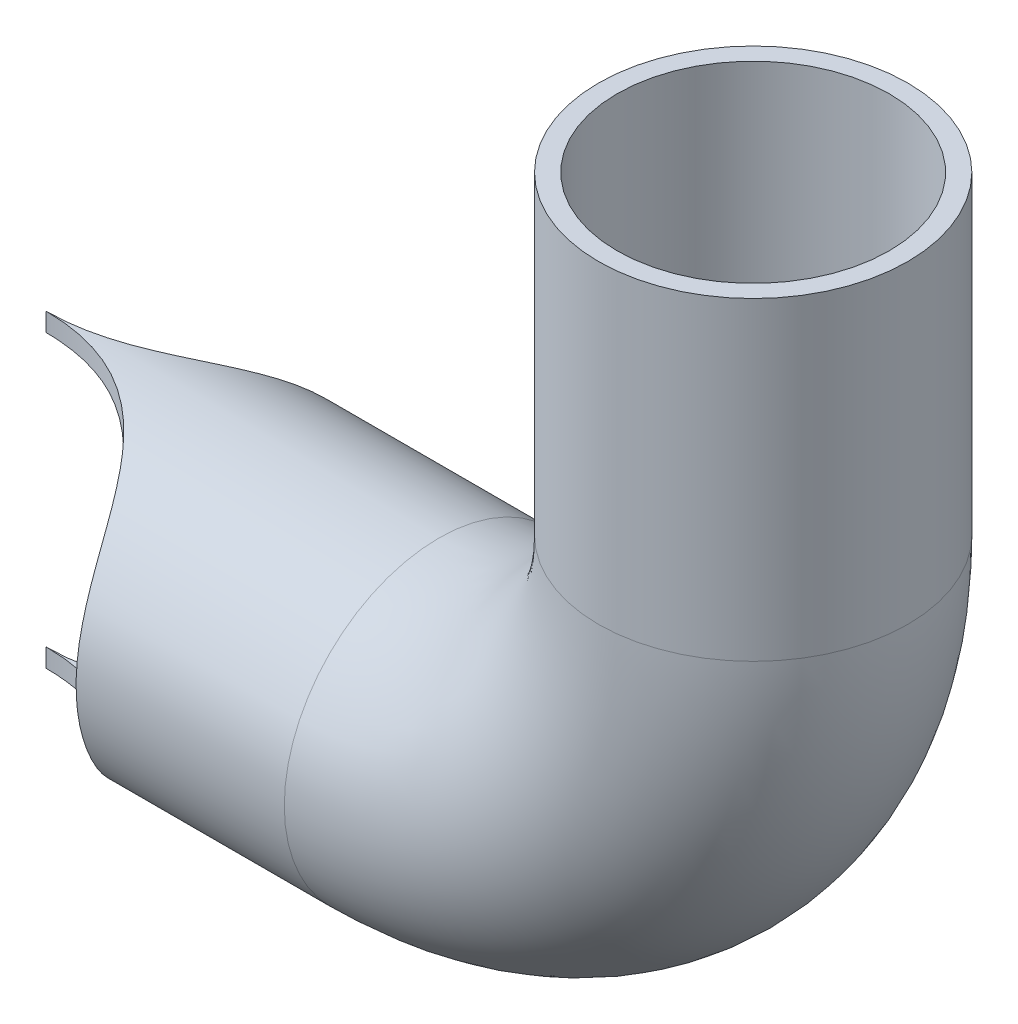
ISO-10303-21;
HEADER;
FILE_DESCRIPTION(('STEP AP214'),'2;1');
FILE_NAME('part.step','',(''),(''),'','','');
FILE_SCHEMA(('AUTOMOTIVE_DESIGN { 1 0 10303 214 1 1 1 1 }'));
ENDSEC;
DATA;
#1=APPLICATION_CONTEXT('core data for automotive mechanical design processes');
#2=APPLICATION_PROTOCOL_DEFINITION('international standard','automotive_design',2000,#1);
#3=PRODUCT_CONTEXT('',#1,'mechanical');
#4=PRODUCT('Part','Part','',(#3));
#5=PRODUCT_RELATED_PRODUCT_CATEGORY('part','',(#4));
#6=PRODUCT_DEFINITION_FORMATION('','',#4);
#7=PRODUCT_DEFINITION_CONTEXT('part definition',#1,'design');
#8=PRODUCT_DEFINITION('design','',#6,#7);
#9=PRODUCT_DEFINITION_SHAPE('','',#8);
#10=(LENGTH_UNIT() NAMED_UNIT(*) SI_UNIT(.MILLI.,.METRE.));
#11=(NAMED_UNIT(*) PLANE_ANGLE_UNIT() SI_UNIT($,.RADIAN.));
#12=(NAMED_UNIT(*) SI_UNIT($,.STERADIAN.) SOLID_ANGLE_UNIT());
#13=UNCERTAINTY_MEASURE_WITH_UNIT(LENGTH_MEASURE(1.E-05),#10,'distance_accuracy_value','');
#14=(GEOMETRIC_REPRESENTATION_CONTEXT(3) GLOBAL_UNCERTAINTY_ASSIGNED_CONTEXT((#13)) GLOBAL_UNIT_ASSIGNED_CONTEXT((#10,
#11,#12)) REPRESENTATION_CONTEXT('',''));
#15=CARTESIAN_POINT('',(0.,0.,0.));
#16=DIRECTION('',(0.,0.,1.));
#17=DIRECTION('',(1.,0.,0.));
#18=AXIS2_PLACEMENT_3D('',#15,#16,#17);
#19=CARTESIAN_POINT('',(0.,0.,0.));
#20=DIRECTION('',(1.,0.,0.));
#21=DIRECTION('',(0.,0.,-1.));
#22=AXIS2_PLACEMENT_3D('',#19,#20,#21);
#23=CYLINDRICAL_SURFACE('',#22,12.5);
#24=CARTESIAN_POINT('',(31.75,0.,0.));
#25=DIRECTION('',(1.,0.,0.));
#26=DIRECTION('',(0.,0.,-1.));
#27=AXIS2_PLACEMENT_3D('',#24,#25,#26);
#28=CIRCLE('',#27,12.5);
#29=CARTESIAN_POINT('',(31.75,-12.5,0.));
#30=VERTEX_POINT('',#29);
#31=EDGE_CURVE('E138',#30,#30,#28,.T.);
#32=ORIENTED_EDGE('',*,*,#31,.F.);
#33=EDGE_LOOP('',(#32));
#34=FACE_BOUND('',#33,.T.);
#35=CARTESIAN_POINT('',(0.,12.5,0.));
#36=CARTESIAN_POINT('',(0.21132329214614,12.4999901512112,2.3320373559167E-06));
#37=CARTESIAN_POINT('',(0.422643978695971,12.4999997532526,-0.00441937796072912));
#38=CARTESIAN_POINT('',(0.844910089481945,12.4999861895717,-0.0220920521102934));
#39=CARTESIAN_POINT('',(1.0558555237812,12.4999630247419,-0.0353427758037998));
#40=CARTESIAN_POINT('',(1.47701878081357,12.4998122629634,-0.0706551651354307));
#41=CARTESIAN_POINT('',(1.68723658211007,12.4996846629638,-0.0927170881669296));
#42=CARTESIAN_POINT('',(2.10655180210927,12.4991793492129,-0.145606431532873));
#43=CARTESIAN_POINT('',(2.31564919195839,12.4988016290512,-0.176434076513245));
#44=CARTESIAN_POINT('',(2.94229675667197,12.4970177387802,-0.282267884208314));
#45=CARTESIAN_POINT('',(3.35772600829388,12.4949589489966,-0.370501250347065));
#46=CARTESIAN_POINT('',(3.97399902947265,12.4889235300459,-0.528683878617068));
#47=CARTESIAN_POINT('',(4.17828296974511,12.4864204241116,-0.585718502983297));
#48=CARTESIAN_POINT('',(4.5843253300597,12.4800665014255,-0.708318050781485));
#49=CARTESIAN_POINT('',(4.78608298108728,12.4762152841589,-0.773885505619478));
#50=CARTESIAN_POINT('',(5.38755924961077,12.4620462319038,-0.983419655439557));
#51=CARTESIAN_POINT('',(5.78288834587859,12.449116582485,-1.14006592725702));
#52=CARTESIAN_POINT('',(6.5585374800017,12.4125996131168,-1.48578019722735));
#53=CARTESIAN_POINT('',(6.93885862647249,12.3890130819844,-1.67484579507597));
#54=CARTESIAN_POINT('',(7.68057343452904,12.3269170331804,-2.08318544425736));
#55=CARTESIAN_POINT('',(8.04200819067913,12.2884415899444,-2.30238978752179));
#56=CARTESIAN_POINT('',(8.7434851621474,12.1918084430564,-2.76883870462715));
#57=CARTESIAN_POINT('',(9.08353430007056,12.1336571478463,-3.0160741313092));
#58=CARTESIAN_POINT('',(9.66037558726133,12.009596439903,-3.47295244106357));
#59=CARTESIAN_POINT('',(9.90239916890909,11.9488766733446,-3.67742632064404));
#60=CARTESIAN_POINT('',(10.3706127505808,11.8110444958904,-4.09857175483758));
#61=CARTESIAN_POINT('',(10.5968065332503,11.7339360190976,-4.31524037294819));
#62=CARTESIAN_POINT('',(11.0318579462371,11.5613911632884,-4.7582226654091));
#63=CARTESIAN_POINT('',(11.2407258679947,11.4659657776622,-4.98453049145305));
#64=CARTESIAN_POINT('',(11.6400619412211,11.2550799262643,-5.44399203727815));
#65=CARTESIAN_POINT('',(11.8305297721364,11.1396191115471,-5.67714587623357));
#66=CARTESIAN_POINT('',(12.1930646779766,10.886791761016,-6.14813321869361));
#67=CARTESIAN_POINT('',(12.365033476385,10.7493170406255,-6.38598446500106));
#68=CARTESIAN_POINT('',(12.6889642509422,10.4522036286798,-6.86148779643085));
#69=CARTESIAN_POINT('',(12.8409261871767,10.2925648929081,-7.09913988115492));
#70=CARTESIAN_POINT('',(13.1248829048774,9.95106802774143,-7.57039747260967));
#71=CARTESIAN_POINT('',(13.2568767258524,9.76920883027488,-7.80400278420729));
#72=CARTESIAN_POINT('',(13.5014710287755,9.38385005883841,-8.26336586145932));
#73=CARTESIAN_POINT('',(13.6140724497105,9.18035153342464,-8.48912400665359));
#74=CARTESIAN_POINT('',(13.8123637275755,8.77064950038252,-8.9109394390885));
#75=CARTESIAN_POINT('',(13.8995136539773,8.56608186879935,-9.10790462130059));
#76=CARTESIAN_POINT('',(14.0595933634377,8.14088218587055,-9.4898735276374));
#77=CARTESIAN_POINT('',(14.1325240466769,7.92025115266951,-9.67487800846491));
#78=CARTESIAN_POINT('',(14.2655257629506,7.46426009407663,-10.0308778436705));
#79=CARTESIAN_POINT('',(14.3255947584973,7.2288977426396,-10.2018709757923));
#80=CARTESIAN_POINT('',(14.4343158065699,6.74497464299992,-10.5280805569805));
#81=CARTESIAN_POINT('',(14.4829672861919,6.49641323326701,-10.6832962141492));
#82=CARTESIAN_POINT('',(14.5721639966706,5.97695087381458,-10.9826988168366));
#83=CARTESIAN_POINT('',(14.6122813361257,5.70554993759742,-11.1261455816105));
#84=CARTESIAN_POINT('',(14.6833121352666,5.1519472670789,-11.3930629846546));
#85=CARTESIAN_POINT('',(14.7142254364917,4.86974534691769,-11.5165332789849));
#86=CARTESIAN_POINT('',(14.768313970459,4.29628039008227,-11.7425288731201));
#87=CARTESIAN_POINT('',(14.7914872425127,4.0050150778836,-11.8450488632871));
#88=CARTESIAN_POINT('',(14.8313474251272,3.41528797109985,-12.0283485208813));
#89=CARTESIAN_POINT('',(14.8480340635144,3.11682587510156,-12.1091272760204));
#90=CARTESIAN_POINT('',(14.8770666264176,2.49032450793106,-12.2539693472045));
#91=CARTESIAN_POINT('',(14.8889571453181,2.1618327403233,-12.3161727190409));
#92=CARTESIAN_POINT('',(14.9073082441083,1.50076721109718,-12.4140792327142));
#93=CARTESIAN_POINT('',(14.9137685540677,1.16819324739068,-12.449781057176));
#94=CARTESIAN_POINT('',(14.9218054222032,0.501121244379905,-12.4944244649743));
#95=CARTESIAN_POINT('',(14.9233809131139,0.166622800594987,-12.5033602002771));
#96=CARTESIAN_POINT('',(14.9217825147497,-0.50200238445906,-12.494390109197));
#97=CARTESIAN_POINT('',(14.9186085864549,-0.836129122651789,-12.4764840622894));
#98=CARTESIAN_POINT('',(14.9070518387986,-1.51263242693613,-12.4129401361916));
#99=CARTESIAN_POINT('',(14.8985028575269,-1.85492358349631,-12.3664186885874));
#100=CARTESIAN_POINT('',(14.8752932912848,-2.53429588684685,-12.2452604991742));
#101=CARTESIAN_POINT('',(14.8606325176988,-2.87137687251364,-12.1706228896816));
#102=CARTESIAN_POINT('',(14.8240015930695,-3.53791042012084,-11.9938352340449));
#103=CARTESIAN_POINT('',(14.8020301868072,-3.86736166165438,-11.891680463841));
#104=CARTESIAN_POINT('',(14.7491865416444,-4.5160774931555,-11.660770532565));
#105=CARTESIAN_POINT('',(14.7183144820842,-4.83534228822719,-11.5320159074718));
#106=CARTESIAN_POINT('',(14.6461160170585,-5.45792661773903,-11.2506228351167));
#107=CARTESIAN_POINT('',(14.6049013664539,-5.76137719145609,-11.0982459649908));
#108=CARTESIAN_POINT('',(14.5097505251313,-6.35339828000701,-10.7702751390085));
#109=CARTESIAN_POINT('',(14.4558143207601,-6.64196877887083,-10.5946811582352));
#110=CARTESIAN_POINT('',(14.3330231543749,-7.20161360541305,-10.2225046947645));
#111=CARTESIAN_POINT('',(14.2641786408949,-7.47270001504406,-10.0259369602846));
#112=CARTESIAN_POINT('',(14.1093336061657,-7.99527828412305,-9.61436974155859));
#113=CARTESIAN_POINT('',(14.0233345677112,-8.24677183451845,-9.39937185128478));
#114=CARTESIAN_POINT('',(13.8385410910742,-8.71206112010874,-8.96903740586821));
#115=CARTESIAN_POINT('',(13.7409814310328,-8.92725221369018,-8.75467841695746));
#116=CARTESIAN_POINT('',(13.5278230497354,-9.33741410591702,-8.31582140689372));
#117=CARTESIAN_POINT('',(13.41222528572,-9.5323859766365,-8.09132392421617));
#118=CARTESIAN_POINT('',(13.1621170324337,-9.90109084374865,-7.63572216453808));
#119=CARTESIAN_POINT('',(13.0276150251809,-10.0748333004248,-7.40462088739699));
#120=CARTESIAN_POINT('',(12.7392242220515,-10.4007712074586,-6.93935415596623));
#121=CARTESIAN_POINT('',(12.5853361126119,-10.5529674203359,-6.70518881043423));
#122=CARTESIAN_POINT('',(12.2695993098591,-10.8261917061767,-6.25366562119726));
#123=CARTESIAN_POINT('',(12.1090400767184,-10.9486483786355,-6.03626692446714));
#124=CARTESIAN_POINT('',(11.7716528500022,-11.1756657047371,-5.60481233579564));
#125=CARTESIAN_POINT('',(11.5948257333152,-11.2802273221099,-5.39075626440327));
#126=CARTESIAN_POINT('',(11.2255937171629,-11.4724730789181,-4.96852095319637));
#127=CARTESIAN_POINT('',(11.0331854068686,-11.5601535086817,-4.76034301366939));
#128=CARTESIAN_POINT('',(10.6337722254044,-11.7199217080289,-4.35218122003031));
#129=CARTESIAN_POINT('',(10.4267665690114,-11.7920086379546,-4.15219780763596));
#130=CARTESIAN_POINT('',(9.98701100311811,-11.9258398870714,-3.75120657721988));
#131=CARTESIAN_POINT('',(9.75346571498077,-11.9867558758804,-3.5507955071814));
#132=CARTESIAN_POINT('',(9.27265606318249,-12.0948226950009,-3.163187925924));
#133=CARTESIAN_POINT('',(9.02539127863807,-12.141973102737,-2.97599182051139));
#134=CARTESIAN_POINT('',(8.51840375775576,-12.2245439885509,-2.61622105603536));
#135=CARTESIAN_POINT('',(8.25867480930698,-12.2599585465176,-2.44365380901575));
#136=CARTESIAN_POINT('',(7.72821878761056,-12.3210111664827,-2.11440805752985));
#137=CARTESIAN_POINT('',(7.45749044532723,-12.3466480968401,-1.95773139374411));
#138=CARTESIAN_POINT('',(6.8596431497222,-12.3937094939454,-1.63606312771312));
#139=CARTESIAN_POINT('',(6.53074331273844,-12.4136836727909,-1.47416253069665));
#140=CARTESIAN_POINT('',(5.86172592632521,-12.4456131071542,-1.17449063862848));
#141=CARTESIAN_POINT('',(5.52160672745045,-12.4575671780113,-1.03672291049396));
#142=CARTESIAN_POINT('',(4.83213518430324,-12.475885028756,-0.786176168744321));
#143=CARTESIAN_POINT('',(4.48278241238245,-12.4822485492509,-0.67339831480068));
#144=CARTESIAN_POINT('',(3.77682228571355,-12.4914303570145,-0.473493956278364));
#145=CARTESIAN_POINT('',(3.42021630025811,-12.4942493072444,-0.38636265721415));
#146=CARTESIAN_POINT('',(2.80916020493591,-12.4973945651643,-0.260366306185043));
#147=CARTESIAN_POINT('',(2.55605980982293,-12.49821425318,-0.214859735304822));
#148=CARTESIAN_POINT('',(2.04789690139367,-12.4993126044617,-0.136780708220199));
#149=CARTESIAN_POINT('',(1.79283467496356,-12.4995913453773,-0.104206396206982));
#150=CARTESIAN_POINT('',(1.28182469358971,-12.4999199040326,-0.0521175198490146));
#151=CARTESIAN_POINT('',(1.0258792053664,-12.4999701132763,-0.0325806697087005));
#152=CARTESIAN_POINT('',(0.51328984690659,-12.4999993116617,-0.00651809373974846));
#153=CARTESIAN_POINT('',(0.256645881676575,-12.4999782905769,5.76362815014732E-06));
#154=CARTESIAN_POINT('',(0.,-12.5,0.));
#155=B_SPLINE_CURVE_WITH_KNOTS('',3,(#35,#36,#37,#38,#39,#40,#41,#42,#43,#44,#45,#46,#47,#48,
#49,#50,#51,#52,#53,#54,#55,#56,#57,#58,#59,#60,#61,#62,#63,#64,#65,#66,#67,#68,#69,#70,#71,#72,
#73,#74,#75,#76,#77,#78,#79,#80,#81,#82,#83,#84,#85,#86,#87,#88,#89,#90,#91,#92,#93,#94,#95,#96,
#97,#98,#99,#100,#101,#102,#103,#104,#105,#106,#107,#108,#109,#110,#111,#112,#113,#114,#115,
#116,#117,#118,#119,#120,#121,#122,#123,#124,#125,#126,#127,#128,#129,#130,#131,#132,#133,#134,
#135,#136,#137,#138,#139,#140,#141,#142,#143,#144,#145,#146,#147,#148,#149,#150,#151,#152,#153,
#154),.UNSPECIFIED.,.F.,.F.,(4,2,2,2,2,2,2,2,2,2,2,2,2,2,2,2,2,2,2,2,2,2,2,2,2,2,2,2,2,2,2,2,2,
2,2,2,2,2,2,2,2,2,2,2,2,2,2,2,2,2,2,2,2,2,2,2,2,2,2,4),(0.,0.633918520328162,1.26781977660652,
1.90173955180752,2.53567557442482,3.80797884839515,4.44416053015446,5.08053137787412,
6.35510325612689,7.62958080668336,8.90115870323461,10.1723228437982,11.1391858259767,
12.1058169747074,13.0718697772984,14.0379394067602,15.0089112248999,15.9798849801243,
16.9509054255463,17.9218788405846,18.8120100404843,19.7020848703423,20.5923005974973,
21.4825609840126,22.4103296331851,23.3381142542846,24.2661337219741,25.1941921243958,
26.1966743615607,27.1992064281449,28.2019575186545,29.2047168475409,30.2401110393949,
31.2755371868201,32.3111412063725,33.3467243608614,34.371566333079,35.3964094051845,
36.4205365242012,37.4445751585336,38.4003642399197,39.3561026170242,40.3114135311716,
41.2666906284929,42.1558079443607,43.044877362141,43.9341419321086,44.8234543740978,
45.7636773948919,46.7039292755909,47.6446547438355,48.5854890565539,49.6857743614131,
50.7862221550828,51.8867210050638,52.9870139918458,53.7581868122117,54.5292489274731,
55.2989896158733,56.0688408189553),.UNSPECIFIED.);
#156=CARTESIAN_POINT('',(0.,12.5,0.));
#157=VERTEX_POINT('',#156);
#158=CARTESIAN_POINT('',(0.,-12.5,0.));
#159=VERTEX_POINT('',#158);
#160=EDGE_CURVE('E77',#157,#159,#155,.T.);
#161=ORIENTED_EDGE('',*,*,#160,.F.);
#162=CARTESIAN_POINT('',(0.,12.5,0.));
#163=CARTESIAN_POINT('',(0.21132329214614,12.4999901512112,-2.3320373559167E-06));
#164=CARTESIAN_POINT('',(0.422643978695971,12.4999997532526,0.00441937796072912));
#165=CARTESIAN_POINT('',(0.844910089481945,12.4999861895717,0.0220920521102934));
#166=CARTESIAN_POINT('',(1.0558555237812,12.4999630247419,0.0353427758037998));
#167=CARTESIAN_POINT('',(1.47701878081357,12.4998122629634,0.0706551651354307));
#168=CARTESIAN_POINT('',(1.68723658211007,12.4996846629638,0.0927170881669296));
#169=CARTESIAN_POINT('',(2.10655180210927,12.4991793492129,0.145606431532873));
#170=CARTESIAN_POINT('',(2.31564919195839,12.4988016290512,0.176434076513245));
#171=CARTESIAN_POINT('',(2.94229675667197,12.4970177387802,0.282267884208314));
#172=CARTESIAN_POINT('',(3.35772600829388,12.4949589489966,0.370501250347065));
#173=CARTESIAN_POINT('',(3.97399902947265,12.4889235300459,0.528683878617068));
#174=CARTESIAN_POINT('',(4.17828296974511,12.4864204241116,0.585718502983297));
#175=CARTESIAN_POINT('',(4.5843253300597,12.4800665014255,0.708318050781485));
#176=CARTESIAN_POINT('',(4.78608298108728,12.4762152841589,0.773885505619478));
#177=CARTESIAN_POINT('',(5.38755924961077,12.4620462319038,0.983419655439557));
#178=CARTESIAN_POINT('',(5.78288834587859,12.449116582485,1.14006592725702));
#179=CARTESIAN_POINT('',(6.5585374800017,12.4125996131168,1.48578019722735));
#180=CARTESIAN_POINT('',(6.93885862647249,12.3890130819844,1.67484579507597));
#181=CARTESIAN_POINT('',(7.68057343452904,12.3269170331804,2.08318544425736));
#182=CARTESIAN_POINT('',(8.04200819067913,12.2884415899444,2.30238978752179));
#183=CARTESIAN_POINT('',(8.7434851621474,12.1918084430564,2.76883870462715));
#184=CARTESIAN_POINT('',(9.08353430007056,12.1336571478463,3.0160741313092));
#185=CARTESIAN_POINT('',(9.66037558726133,12.009596439903,3.47295244106357));
#186=CARTESIAN_POINT('',(9.90239916890909,11.9488766733446,3.67742632064404));
#187=CARTESIAN_POINT('',(10.3706127505808,11.8110444958904,4.09857175483758));
#188=CARTESIAN_POINT('',(10.5968065332503,11.7339360190976,4.31524037294819));
#189=CARTESIAN_POINT('',(11.0318579462371,11.5613911632884,4.7582226654091));
#190=CARTESIAN_POINT('',(11.2407258679947,11.4659657776622,4.98453049145305));
#191=CARTESIAN_POINT('',(11.6400619412211,11.2550799262643,5.44399203727815));
#192=CARTESIAN_POINT('',(11.8305297721364,11.1396191115471,5.67714587623357));
#193=CARTESIAN_POINT('',(12.1930646779766,10.886791761016,6.14813321869361));
#194=CARTESIAN_POINT('',(12.365033476385,10.7493170406255,6.38598446500106));
#195=CARTESIAN_POINT('',(12.6889642509422,10.4522036286798,6.86148779643085));
#196=CARTESIAN_POINT('',(12.8409261871767,10.2925648929081,7.09913988115492));
#197=CARTESIAN_POINT('',(13.1248829048774,9.95106802774143,7.57039747260967));
#198=CARTESIAN_POINT('',(13.2568767258524,9.76920883027488,7.80400278420729));
#199=CARTESIAN_POINT('',(13.5014710287755,9.38385005883841,8.26336586145932));
#200=CARTESIAN_POINT('',(13.6140724497105,9.18035153342464,8.48912400665359));
#201=CARTESIAN_POINT('',(13.8123637275755,8.77064950038252,8.9109394390885));
#202=CARTESIAN_POINT('',(13.8995136539773,8.56608186879935,9.10790462130059));
#203=CARTESIAN_POINT('',(14.0595933634377,8.14088218587055,9.4898735276374));
#204=CARTESIAN_POINT('',(14.1325240466769,7.92025115266951,9.67487800846491));
#205=CARTESIAN_POINT('',(14.2655257629506,7.46426009407663,10.0308778436705));
#206=CARTESIAN_POINT('',(14.3255947584973,7.2288977426396,10.2018709757923));
#207=CARTESIAN_POINT('',(14.4343158065699,6.74497464299992,10.5280805569805));
#208=CARTESIAN_POINT('',(14.4829672861919,6.49641323326701,10.6832962141492));
#209=CARTESIAN_POINT('',(14.5721639966706,5.97695087381458,10.9826988168366));
#210=CARTESIAN_POINT('',(14.6122813361257,5.70554993759742,11.1261455816105));
#211=CARTESIAN_POINT('',(14.6833121352666,5.1519472670789,11.3930629846546));
#212=CARTESIAN_POINT('',(14.7142254364917,4.86974534691769,11.5165332789849));
#213=CARTESIAN_POINT('',(14.768313970459,4.29628039008227,11.7425288731201));
#214=CARTESIAN_POINT('',(14.7914872425127,4.0050150778836,11.8450488632871));
#215=CARTESIAN_POINT('',(14.8313474251272,3.41528797109985,12.0283485208813));
#216=CARTESIAN_POINT('',(14.8480340635144,3.11682587510156,12.1091272760204));
#217=CARTESIAN_POINT('',(14.8770666264176,2.49032450793106,12.2539693472045));
#218=CARTESIAN_POINT('',(14.8889571453181,2.1618327403233,12.3161727190409));
#219=CARTESIAN_POINT('',(14.9073082441083,1.50076721109718,12.4140792327142));
#220=CARTESIAN_POINT('',(14.9137685540677,1.16819324739068,12.449781057176));
#221=CARTESIAN_POINT('',(14.9218054222032,0.501121244379905,12.4944244649743));
#222=CARTESIAN_POINT('',(14.9233809131139,0.166622800594987,12.5033602002771));
#223=CARTESIAN_POINT('',(14.9217825147497,-0.50200238445906,12.494390109197));
#224=CARTESIAN_POINT('',(14.9186085864549,-0.836129122651789,12.4764840622894));
#225=CARTESIAN_POINT('',(14.9070518387986,-1.51263242693613,12.4129401361916));
#226=CARTESIAN_POINT('',(14.8985028575269,-1.85492358349631,12.3664186885874));
#227=CARTESIAN_POINT('',(14.8752932912848,-2.53429588684685,12.2452604991742));
#228=CARTESIAN_POINT('',(14.8606325176988,-2.87137687251364,12.1706228896816));
#229=CARTESIAN_POINT('',(14.8240015930695,-3.53791042012084,11.9938352340449));
#230=CARTESIAN_POINT('',(14.8020301868072,-3.86736166165438,11.891680463841));
#231=CARTESIAN_POINT('',(14.7491865416444,-4.5160774931555,11.660770532565));
#232=CARTESIAN_POINT('',(14.7183144820842,-4.83534228822719,11.5320159074718));
#233=CARTESIAN_POINT('',(14.6461160170585,-5.45792661773903,11.2506228351167));
#234=CARTESIAN_POINT('',(14.6049013664539,-5.76137719145609,11.0982459649908));
#235=CARTESIAN_POINT('',(14.5097505251313,-6.35339828000701,10.7702751390085));
#236=CARTESIAN_POINT('',(14.4558143207601,-6.64196877887083,10.5946811582352));
#237=CARTESIAN_POINT('',(14.3330231543749,-7.20161360541305,10.2225046947645));
#238=CARTESIAN_POINT('',(14.2641786408949,-7.47270001504406,10.0259369602846));
#239=CARTESIAN_POINT('',(14.1093336061657,-7.99527828412305,9.61436974155859));
#240=CARTESIAN_POINT('',(14.0233345677112,-8.24677183451845,9.39937185128478));
#241=CARTESIAN_POINT('',(13.8385410910742,-8.71206112010874,8.96903740586821));
#242=CARTESIAN_POINT('',(13.7409814310328,-8.92725221369018,8.75467841695746));
#243=CARTESIAN_POINT('',(13.5278230497354,-9.33741410591702,8.31582140689372));
#244=CARTESIAN_POINT('',(13.41222528572,-9.5323859766365,8.09132392421617));
#245=CARTESIAN_POINT('',(13.1621170324337,-9.90109084374865,7.63572216453808));
#246=CARTESIAN_POINT('',(13.0276150251809,-10.0748333004248,7.40462088739699));
#247=CARTESIAN_POINT('',(12.7392242220515,-10.4007712074586,6.93935415596623));
#248=CARTESIAN_POINT('',(12.5853361126119,-10.5529674203359,6.70518881043423));
#249=CARTESIAN_POINT('',(12.2695993098591,-10.8261917061767,6.25366562119726));
#250=CARTESIAN_POINT('',(12.1090400767184,-10.9486483786355,6.03626692446714));
#251=CARTESIAN_POINT('',(11.7716528500022,-11.1756657047371,5.60481233579564));
#252=CARTESIAN_POINT('',(11.5948257333152,-11.2802273221099,5.39075626440327));
#253=CARTESIAN_POINT('',(11.2255937171629,-11.4724730789181,4.96852095319637));
#254=CARTESIAN_POINT('',(11.0331854068686,-11.5601535086817,4.76034301366939));
#255=CARTESIAN_POINT('',(10.6337722254044,-11.7199217080289,4.35218122003031));
#256=CARTESIAN_POINT('',(10.4267665690114,-11.7920086379546,4.15219780763596));
#257=CARTESIAN_POINT('',(9.98701100311811,-11.9258398870714,3.75120657721988));
#258=CARTESIAN_POINT('',(9.75346571498077,-11.9867558758804,3.5507955071814));
#259=CARTESIAN_POINT('',(9.27265606318249,-12.0948226950009,3.163187925924));
#260=CARTESIAN_POINT('',(9.02539127863807,-12.141973102737,2.97599182051139));
#261=CARTESIAN_POINT('',(8.51840375775576,-12.2245439885509,2.61622105603536));
#262=CARTESIAN_POINT('',(8.25867480930698,-12.2599585465176,2.44365380901575));
#263=CARTESIAN_POINT('',(7.72821878761056,-12.3210111664827,2.11440805752985));
#264=CARTESIAN_POINT('',(7.45749044532723,-12.3466480968401,1.95773139374411));
#265=CARTESIAN_POINT('',(6.8596431497222,-12.3937094939454,1.63606312771312));
#266=CARTESIAN_POINT('',(6.53074331273844,-12.4136836727909,1.47416253069665));
#267=CARTESIAN_POINT('',(5.86172592632521,-12.4456131071542,1.17449063862848));
#268=CARTESIAN_POINT('',(5.52160672745045,-12.4575671780113,1.03672291049396));
#269=CARTESIAN_POINT('',(4.83213518430324,-12.475885028756,0.786176168744321));
#270=CARTESIAN_POINT('',(4.48278241238245,-12.4822485492509,0.67339831480068));
#271=CARTESIAN_POINT('',(3.77682228571355,-12.4914303570145,0.473493956278364));
#272=CARTESIAN_POINT('',(3.42021630025811,-12.4942493072444,0.38636265721415));
#273=CARTESIAN_POINT('',(2.80916020493591,-12.4973945651643,0.260366306185043));
#274=CARTESIAN_POINT('',(2.55605980982293,-12.49821425318,0.214859735304822));
#275=CARTESIAN_POINT('',(2.04789690139367,-12.4993126044617,0.136780708220199));
#276=CARTESIAN_POINT('',(1.79283467496356,-12.4995913453773,0.104206396206982));
#277=CARTESIAN_POINT('',(1.28182469358971,-12.4999199040326,0.0521175198490146));
#278=CARTESIAN_POINT('',(1.0258792053664,-12.4999701132763,0.0325806697087005));
#279=CARTESIAN_POINT('',(0.51328984690659,-12.4999993116617,0.00651809373974846));
#280=CARTESIAN_POINT('',(0.256645881676575,-12.4999782905769,-5.76362815014732E-06));
#281=CARTESIAN_POINT('',(0.,-12.5,0.));
#282=B_SPLINE_CURVE_WITH_KNOTS('',3,(#162,#163,#164,#165,#166,#167,#168,#169,#170,#171,#172,
#173,#174,#175,#176,#177,#178,#179,#180,#181,#182,#183,#184,#185,#186,#187,#188,#189,#190,#191,
#192,#193,#194,#195,#196,#197,#198,#199,#200,#201,#202,#203,#204,#205,#206,#207,#208,#209,#210,
#211,#212,#213,#214,#215,#216,#217,#218,#219,#220,#221,#222,#223,#224,#225,#226,#227,#228,#229,
#230,#231,#232,#233,#234,#235,#236,#237,#238,#239,#240,#241,#242,#243,#244,#245,#246,#247,#248,
#249,#250,#251,#252,#253,#254,#255,#256,#257,#258,#259,#260,#261,#262,#263,#264,#265,#266,#267,
#268,#269,#270,#271,#272,#273,#274,#275,#276,#277,#278,#279,#280,#281),.UNSPECIFIED.,.F.,.F.,(4,
2,2,2,2,2,2,2,2,2,2,2,2,2,2,2,2,2,2,2,2,2,2,2,2,2,2,2,2,2,2,2,2,2,2,2,2,2,2,2,2,2,2,2,2,2,2,2,2,
2,2,2,2,2,2,2,2,2,2,4),(0.,0.633918520328162,1.26781977660652,1.90173955180752,2.53567557442482,
3.80797884839515,4.44416053015446,5.08053137787412,6.35510325612689,7.62958080668336,
8.90115870323461,10.1723228437982,11.1391858259767,12.1058169747074,13.0718697772984,
14.0379394067602,15.0089112248999,15.9798849801243,16.9509054255463,17.9218788405846,
18.8120100404843,19.7020848703423,20.5923005974973,21.4825609840126,22.4103296331851,
23.3381142542846,24.2661337219741,25.1941921243958,26.1966743615607,27.1992064281449,
28.2019575186545,29.2047168475409,30.2401110393949,31.2755371868201,32.3111412063725,
33.3467243608614,34.371566333079,35.3964094051845,36.4205365242012,37.4445751585336,
38.4003642399197,39.3561026170242,40.3114135311716,41.2666906284929,42.1558079443607,
43.044877362141,43.9341419321086,44.8234543740978,45.7636773948919,46.7039292755909,
47.6446547438355,48.5854890565539,49.6857743614131,50.7862221550828,51.8867210050638,
52.9870139918458,53.7581868122117,54.5292489274731,55.2989896158733,56.0688408189553),.UNSPECIFIED.);
#283=EDGE_CURVE('E58',#157,#159,#282,.T.);
#284=ORIENTED_EDGE('',*,*,#283,.T.);
#285=EDGE_LOOP('',(#161,#284));
#286=FACE_BOUND('',#285,.T.);
#287=ADVANCED_FACE('F37',(#34,#286),#23,.T.);
#288=CARTESIAN_POINT('',(-1.,0.,0.));
#289=DIRECTION('',(1.,0.,0.));
#290=DIRECTION('',(0.,0.,-1.));
#291=AXIS2_PLACEMENT_3D('',#288,#289,#290);
#292=CYLINDRICAL_SURFACE('',#291,11.);
#293=CARTESIAN_POINT('',(31.75,0.,0.));
#294=DIRECTION('',(-1.,0.,0.));
#295=DIRECTION('',(0.,0.,1.));
#296=AXIS2_PLACEMENT_3D('',#293,#294,#295);
#297=CIRCLE('',#296,11.);
#298=CARTESIAN_POINT('',(31.75,-11.,0.));
#299=VERTEX_POINT('',#298);
#300=EDGE_CURVE('E80',#299,#299,#297,.T.);
#301=ORIENTED_EDGE('',*,*,#300,.F.);
#302=EDGE_LOOP('',(#301));
#303=FACE_BOUND('',#302,.T.);
#304=CARTESIAN_POINT('',(0.,-11.,0.));
#305=CARTESIAN_POINT('',(0.233794898345149,-10.9999832072972,3.6913290394146E-06));
#306=CARTESIAN_POINT('',(0.467587127392515,-10.9999995634435,-0.00540918435756685));
#307=CARTESIAN_POINT('',(0.934670794630539,-10.9999765065178,-0.0270396068280975));
#308=CARTESIAN_POINT('',(1.16796223381857,-10.9999370935569,-0.043257132073462));
#309=CARTESIAN_POINT('',(1.63360004713171,-10.99968040471,-0.0864730539072198));
#310=CARTESIAN_POINT('',(1.8659462064246,-10.9994630904392,-0.113473776488142));
#311=CARTESIAN_POINT('',(2.32912092746776,-10.9986034683607,-0.178189857037225));
#312=CARTESIAN_POINT('',(2.55994949107845,-10.9979611610742,-0.215905201867783));
#313=CARTESIAN_POINT('',(3.25224518092728,-10.9949206459866,-0.345546429243648));
#314=CARTESIAN_POINT('',(3.71077992988526,-10.9914034036678,-0.45371333110898));
#315=CARTESIAN_POINT('',(4.61558569805145,-10.9776822567602,-0.712166278925732));
#316=CARTESIAN_POINT('',(5.06185890693602,-10.96747955426,-0.862444750165628));
#317=CARTESIAN_POINT('',(5.89737789729731,-10.9367848105519,-1.18779096949344));
#318=CARTESIAN_POINT('',(6.28806645883104,-10.9173383681382,-1.35925162121921));
#319=CARTESIAN_POINT('',(7.05290239610081,-10.8641042491263,-1.73408921270013));
#320=CARTESIAN_POINT('',(7.42704885431581,-10.8303157781351,-1.93746791997649));
#321=CARTESIAN_POINT('',(8.1537786270805,-10.7432864207526,-2.37294843098716));
#322=CARTESIAN_POINT('',(8.50644545514754,-10.6901273467813,-2.60492675592845));
#323=CARTESIAN_POINT('',(9.18812876768792,-10.5586634738132,-3.09497576540293));
#324=CARTESIAN_POINT('',(9.5171566482163,-10.4803708922885,-3.35303373087052));
#325=CARTESIAN_POINT('',(10.0512046914058,-10.3216540951901,-3.80820629984437));
#326=CARTESIAN_POINT('',(10.2633533318744,-10.2492190034755,-3.99979473799391));
#327=CARTESIAN_POINT('',(10.6732107055741,-10.0877237712816,-4.39119796920211));
#328=CARTESIAN_POINT('',(10.8709232117593,-9.99866799649264,-4.59101059132812));
#329=CARTESIAN_POINT('',(11.2507299574318,-9.80240100293206,-4.99635956409411));
#330=CARTESIAN_POINT('',(11.4328297932271,-9.69519633090322,-5.20189382854045));
#331=CARTESIAN_POINT('',(11.7805608670012,-9.46140404730254,-5.61589993728837));
#332=CARTESIAN_POINT('',(11.9461916477895,-9.33481589788167,-5.82437186295782));
#333=CARTESIAN_POINT('',(12.2611238878722,-9.0608434733597,-6.24209894167424));
#334=CARTESIAN_POINT('',(12.4103395957542,-8.9133584213884,-6.45135280166167));
#335=CARTESIAN_POINT('',(12.6912328201527,-8.59788682792167,-6.86616535389164));
#336=CARTESIAN_POINT('',(12.822910250541,-8.42990018575343,-7.07172402798331));
#337=CARTESIAN_POINT('',(13.0689321198789,-8.07380320373718,-7.47570785643449));
#338=CARTESIAN_POINT('',(13.1832747174451,-7.88569072964839,-7.67413225125356));
#339=CARTESIAN_POINT('',(13.3952393772957,-7.49029207833062,-8.0605159078859));
#340=CARTESIAN_POINT('',(13.4928622707075,-7.28300685495797,-8.24847568957576));
#341=CARTESIAN_POINT('',(13.6650410142328,-6.86837472109485,-8.59607619925809));
#342=CARTESIAN_POINT('',(13.7408313418463,-6.66242374622145,-8.75677546087377));
#343=CARTESIAN_POINT('',(13.8801587310343,-6.23685521720585,-9.06480141168703));
#344=CARTESIAN_POINT('',(13.9436965490046,-6.01723850781124,-9.21212892607793));
#345=CARTESIAN_POINT('',(14.0596217495885,-5.5657901158518,-9.49170618614374));
#346=CARTESIAN_POINT('',(14.1120082128423,-5.33395742811978,-9.62395468823092));
#347=CARTESIAN_POINT('',(14.2067549008295,-4.85965882275139,-9.87194713062815));
#348=CARTESIAN_POINT('',(14.2491147287592,-4.61719248473869,-9.98769041767295));
#349=CARTESIAN_POINT('',(14.3258646292926,-4.11693232762015,-10.2042661784065));
#350=CARTESIAN_POINT('',(14.3600230866258,-3.85890507706103,-10.3046414340126));
#351=CARTESIAN_POINT('',(14.4200020162955,-3.33514930525576,-10.4858751912286));
#352=CARTESIAN_POINT('',(14.4458224151554,-3.0694207161665,-10.5667335208502));
#353=CARTESIAN_POINT('',(14.4900310197443,-2.53198103656566,-10.7082353018641));
#354=CARTESIAN_POINT('',(14.5084178715139,-2.26026886568887,-10.7688750702596));
#355=CARTESIAN_POINT('',(14.5384523547419,-1.71266637468484,-10.8694193536606));
#356=CARTESIAN_POINT('',(14.5500997865965,-1.43677593105654,-10.909323254521));
#357=CARTESIAN_POINT('',(14.5675523398473,-0.868711703573182,-10.9695460030065));
#358=CARTESIAN_POINT('',(14.5730364121655,-0.57641318046271,-10.9887864607378));
#359=CARTESIAN_POINT('',(14.5773486033633,0.00884165815186644,-11.0038910153561));
#360=CARTESIAN_POINT('',(14.576176498637,0.301797995423935,-10.9997543269172));
#361=CARTESIAN_POINT('',(14.56712016858,0.886403398917034,-10.9681353634695));
#362=CARTESIAN_POINT('',(14.5592346418139,1.178052200644,-10.9406485619091));
#363=CARTESIAN_POINT('',(14.5363890708829,1.75795993965327,-10.8625583745036));
#364=CARTESIAN_POINT('',(14.521429024121,2.04621887569117,-10.8119549801726));
#365=CARTESIAN_POINT('',(14.4835096220787,2.62143391845562,-10.6871853496622));
#366=CARTESIAN_POINT('',(14.4604381136104,2.90831140822617,-10.6126901110723));
#367=CARTESIAN_POINT('',(14.4053802547727,3.4743562808077,-10.4410875350244));
#368=CARTESIAN_POINT('',(14.3733937594716,3.75352353819164,-10.3439798299579));
#369=CARTESIAN_POINT('',(14.2993109135581,4.30195557591934,-10.1281782450129));
#370=CARTESIAN_POINT('',(14.25721624341,4.571221993687,-10.0094879539921));
#371=CARTESIAN_POINT('',(14.1615392073158,5.09776317866864,-9.75185627502561));
#372=CARTESIAN_POINT('',(14.1079572532652,5.35503837544501,-9.61291561324736));
#373=CARTESIAN_POINT('',(13.9894130418325,5.84897045556785,-9.32039482103898));
#374=CARTESIAN_POINT('',(13.9247852551925,6.08599069598224,-9.16729288686212));
#375=CARTESIAN_POINT('',(13.7819069409487,6.5448772400894,-8.84551297957637));
#376=CARTESIAN_POINT('',(13.7036567037927,6.766743866736,-8.67683533859726));
#377=CARTESIAN_POINT('',(13.5323684968896,7.19357096729466,-8.32638817230712));
#378=CARTESIAN_POINT('',(13.4393393149716,7.39854137867922,-8.14462646192675));
#379=CARTESIAN_POINT('',(13.2374800134905,7.79037930084828,-7.7706708520781));
#380=CARTESIAN_POINT('',(13.1286506522885,7.97724767975857,-7.5784774535765));
#381=CARTESIAN_POINT('',(12.9008527772794,8.32238334062207,-7.19725362244111));
#382=CARTESIAN_POINT('',(12.7827461923827,8.48164904204515,-7.00861047140459));
#383=CARTESIAN_POINT('',(12.5315821090089,8.7827311266702,-6.6274145136233));
#384=CARTESIAN_POINT('',(12.3985252495395,8.92454825512046,-6.43486187426673));
#385=CARTESIAN_POINT('',(12.117544050735,9.19075865864188,-6.04855334042753));
#386=CARTESIAN_POINT('',(11.9696185520759,9.3151505732375,-5.85479735322536));
#387=CARTESIAN_POINT('',(11.6593065290938,9.54692973158591,-5.468714760044));
#388=CARTESIAN_POINT('',(11.4969195873139,9.65431648420401,-5.27638819550152));
#389=CARTESIAN_POINT('',(11.1564397773715,9.85400131112812,-4.89344675207539));
#390=CARTESIAN_POINT('',(10.9781909609185,9.94611632440537,-4.70287537520804));
#391=CARTESIAN_POINT('',(10.6084504685599,10.1149253558835,-4.32788354672923));
#392=CARTESIAN_POINT('',(10.4169587548756,10.1916193300894,-4.14346311266716));
#393=CARTESIAN_POINT('',(10.0216714561631,10.3309869867319,-3.78260968360399));
#394=CARTESIAN_POINT('',(9.81787273162734,10.3936570723372,-3.60617874697404));
#395=CARTESIAN_POINT('',(9.39905780299818,10.5064785425804,-3.26290643810993));
#396=CARTESIAN_POINT('',(9.18404092060172,10.5566291691692,-3.0960656470264));
#397=CARTESIAN_POINT('',(8.71161892769743,10.6525366170465,-2.7496071559622));
#398=CARTESIAN_POINT('',(8.45261539766993,10.6965764513308,-2.57169264851144));
#399=CARTESIAN_POINT('',(7.92279215421956,10.7726640884569,-2.23160940852867));
#400=CARTESIAN_POINT('',(7.65197143479472,10.8047108680925,-2.06944202036033));
#401=CARTESIAN_POINT('',(7.0997325047328,10.8591143739217,-1.76183399673316));
#402=CARTESIAN_POINT('',(6.81830454735168,10.8814619395649,-1.61640926890898));
#403=CARTESIAN_POINT('',(6.24649269950342,10.9185390462528,-1.34331318735517));
#404=CARTESIAN_POINT('',(5.9561085114924,10.9332683339135,-1.21564242422559));
#405=CARTESIAN_POINT('',(5.3071816237717,10.959466119682,-0.954332615325347));
#406=CARTESIAN_POINT('',(4.94690081948295,10.9696415086441,-0.824863626003932));
#407=CARTESIAN_POINT('',(4.21741408580262,10.9845884983094,-0.593510373796752));
#408=CARTESIAN_POINT('',(3.84820611096212,10.9893588483605,-0.491632499265436));
#409=CARTESIAN_POINT('',(3.103526562067,10.995804452537,-0.316200798356751));
#410=CARTESIAN_POINT('',(2.72806217509025,10.997483040196,-0.242616533689601));
#411=CARTESIAN_POINT('',(1.97278015375034,10.9994608438959,-0.124071002959851));
#412=CARTESIAN_POINT('',(1.5929646026511,10.9997606944802,-0.0790965778550556));
#413=CARTESIAN_POINT('',(1.01033351172658,10.9999629313799,-0.0323546514516935));
#414=CARTESIAN_POINT('',(0.808299370083444,10.9999859338711,-0.0202143908301457));
#415=CARTESIAN_POINT('',(0.404183046860263,11.0000006955801,-0.00404248605288061));
#416=CARTESIAN_POINT('',(0.20210130729348,10.9999924974023,2.03793965918139E-07));
#417=CARTESIAN_POINT('',(0.,11.,0.));
#418=B_SPLINE_CURVE_WITH_KNOTS('',3,(#304,#305,#306,#307,#308,#309,#310,#311,#312,#313,#314,
#315,#316,#317,#318,#319,#320,#321,#322,#323,#324,#325,#326,#327,#328,#329,#330,#331,#332,#333,
#334,#335,#336,#337,#338,#339,#340,#341,#342,#343,#344,#345,#346,#347,#348,#349,#350,#351,#352,
#353,#354,#355,#356,#357,#358,#359,#360,#361,#362,#363,#364,#365,#366,#367,#368,#369,#370,#371,
#372,#373,#374,#375,#376,#377,#378,#379,#380,#381,#382,#383,#384,#385,#386,#387,#388,#389,#390,
#391,#392,#393,#394,#395,#396,#397,#398,#399,#400,#401,#402,#403,#404,#405,#406,#407,#408,#409,
#410,#411,#412,#413,#414,#415,#416,#417),.UNSPECIFIED.,.F.,.F.,(4,2,2,2,2,2,2,2,2,2,2,2,2,2,2,2,
2,2,2,2,2,2,2,2,2,2,2,2,2,2,2,2,2,2,2,2,2,2,2,2,2,2,2,2,2,2,2,2,2,2,2,2,2,2,2,2,4),(0.,
0.701316888351945,1.4026323786659,2.10409922820776,2.8055652176583,4.21672767163976,
5.62763645911154,6.90727896724298,8.18699236295975,9.46136233067883,10.735113759062,
11.6189486503569,12.5025517140708,13.385836717477,14.26914623455,15.156870532884,
16.0445991905526,16.9324220807557,17.8202008249457,18.6352575716905,19.4502639856442,
20.2653375657997,21.0804433970671,21.9164021564648,22.7523682822827,23.5884866039231,
24.4246296879073,25.302557846371,26.1805154979007,27.0586433853386,27.9367715951231,
28.8275524230719,29.7183477333685,30.6089950530995,31.4996104425455,32.3669214667902,
33.234214001131,34.1009927446525,34.9677298991488,35.7877793931189,36.607793849679,
37.4278722933205,38.2479744177452,39.0772896777961,39.9066073037837,40.7361373890647,
41.5657176899361,42.5166988602701,43.4677611465577,44.4197197317654,45.3717099770774,
46.5194359345723,47.6674274059478,48.8141803884612,49.9604055419942,50.5674586077264,
51.1736830422885),.UNSPECIFIED.);
#419=CARTESIAN_POINT('',(0.,-11.,0.));
#420=VERTEX_POINT('',#419);
#421=CARTESIAN_POINT('',(0.,11.,0.));
#422=VERTEX_POINT('',#421);
#423=EDGE_CURVE('E11',#420,#422,#418,.T.);
#424=ORIENTED_EDGE('',*,*,#423,.F.);
#425=CARTESIAN_POINT('',(0.,-11.,0.));
#426=CARTESIAN_POINT('',(0.233794898345149,-10.9999832072972,-3.69132903802281E-06));
#427=CARTESIAN_POINT('',(0.467587127392514,-10.9999995634435,0.00540918435756815));
#428=CARTESIAN_POINT('',(0.934670794630537,-10.9999765065178,0.0270396068280979));
#429=CARTESIAN_POINT('',(1.16796223381857,-10.9999370935569,0.0432571320734615));
#430=CARTESIAN_POINT('',(1.63360004713171,-10.99968040471,0.086473053907219));
#431=CARTESIAN_POINT('',(1.8659462064246,-10.9994630904392,0.113473776488142));
#432=CARTESIAN_POINT('',(2.32912092746776,-10.9986034683607,0.178189857037226));
#433=CARTESIAN_POINT('',(2.55994949107845,-10.9979611610742,0.215905201867783));
#434=CARTESIAN_POINT('',(3.25224518092728,-10.9949206459866,0.345546429243649));
#435=CARTESIAN_POINT('',(3.71077992988526,-10.9914034036678,0.45371333110898));
#436=CARTESIAN_POINT('',(4.61558569805145,-10.9776822567602,0.712166278925732));
#437=CARTESIAN_POINT('',(5.06185890693602,-10.96747955426,0.862444750165629));
#438=CARTESIAN_POINT('',(5.89737789729731,-10.9367848105519,1.18779096949344));
#439=CARTESIAN_POINT('',(6.28806645883105,-10.9173383681382,1.35925162121921));
#440=CARTESIAN_POINT('',(7.05290239610082,-10.8641042491263,1.73408921270012));
#441=CARTESIAN_POINT('',(7.42704885431582,-10.8303157781351,1.93746791997649));
#442=CARTESIAN_POINT('',(8.1537786270805,-10.7432864207526,2.37294843098717));
#443=CARTESIAN_POINT('',(8.50644545514755,-10.6901273467813,2.60492675592845));
#444=CARTESIAN_POINT('',(9.18812876768792,-10.5586634738132,3.09497576540293));
#445=CARTESIAN_POINT('',(9.51715664821631,-10.4803708922885,3.35303373087052));
#446=CARTESIAN_POINT('',(10.0512046914058,-10.3216540951901,3.80820629984437));
#447=CARTESIAN_POINT('',(10.2633533318744,-10.2492190034755,3.99979473799391));
#448=CARTESIAN_POINT('',(10.6732107055741,-10.0877237712816,4.39119796920211));
#449=CARTESIAN_POINT('',(10.8709232117593,-9.99866799649264,4.59101059132812));
#450=CARTESIAN_POINT('',(11.2507299574318,-9.80240100293206,4.9963595640941));
#451=CARTESIAN_POINT('',(11.4328297932271,-9.69519633090322,5.20189382854044));
#452=CARTESIAN_POINT('',(11.7805608670012,-9.46140404730254,5.61589993728836));
#453=CARTESIAN_POINT('',(11.9461916477895,-9.33481589788167,5.82437186295782));
#454=CARTESIAN_POINT('',(12.2611238878722,-9.0608434733597,6.24209894167424));
#455=CARTESIAN_POINT('',(12.4103395957542,-8.91335842138841,6.45135280166167));
#456=CARTESIAN_POINT('',(12.6912328201527,-8.59788682792168,6.86616535389163));
#457=CARTESIAN_POINT('',(12.822910250541,-8.42990018575344,7.07172402798331));
#458=CARTESIAN_POINT('',(13.0689321198789,-8.07380320373718,7.47570785643449));
#459=CARTESIAN_POINT('',(13.1832747174451,-7.88569072964839,7.67413225125356));
#460=CARTESIAN_POINT('',(13.3952393772957,-7.49029207833062,8.0605159078859));
#461=CARTESIAN_POINT('',(13.4928622707075,-7.28300685495797,8.24847568957576));
#462=CARTESIAN_POINT('',(13.6650410142328,-6.86837472109486,8.59607619925808));
#463=CARTESIAN_POINT('',(13.7408313418463,-6.66242374622146,8.75677546087377));
#464=CARTESIAN_POINT('',(13.8801587310343,-6.23685521720586,9.06480141168702));
#465=CARTESIAN_POINT('',(13.9436965490046,-6.01723850781124,9.21212892607793));
#466=CARTESIAN_POINT('',(14.0596217495885,-5.5657901158518,9.49170618614373));
#467=CARTESIAN_POINT('',(14.1120082128423,-5.33395742811978,9.62395468823092));
#468=CARTESIAN_POINT('',(14.2067549008295,-4.85965882275139,9.87194713062815));
#469=CARTESIAN_POINT('',(14.2491147287592,-4.61719248473869,9.98769041767295));
#470=CARTESIAN_POINT('',(14.3258646292926,-4.11693232762016,10.2042661784065));
#471=CARTESIAN_POINT('',(14.3600230866258,-3.85890507706103,10.3046414340126));
#472=CARTESIAN_POINT('',(14.4200020162955,-3.33514930525576,10.4858751912286));
#473=CARTESIAN_POINT('',(14.4458224151554,-3.0694207161665,10.5667335208502));
#474=CARTESIAN_POINT('',(14.4900310197443,-2.53198103656566,10.7082353018641));
#475=CARTESIAN_POINT('',(14.5084178715139,-2.26026886568887,10.7688750702596));
#476=CARTESIAN_POINT('',(14.5384523547419,-1.71266637468485,10.8694193536606));
#477=CARTESIAN_POINT('',(14.5500997865965,-1.43677593105655,10.909323254521));
#478=CARTESIAN_POINT('',(14.5675523398473,-0.868711703573189,10.9695460030065));
#479=CARTESIAN_POINT('',(14.5730364121655,-0.576413180462717,10.9887864607378));
#480=CARTESIAN_POINT('',(14.5773486033633,0.00884165815185923,11.0038910153561));
#481=CARTESIAN_POINT('',(14.576176498637,0.301797995423928,10.9997543269172));
#482=CARTESIAN_POINT('',(14.56712016858,0.886403398917027,10.9681353634695));
#483=CARTESIAN_POINT('',(14.5592346418139,1.17805220064399,10.9406485619091));
#484=CARTESIAN_POINT('',(14.5363890708829,1.75795993965326,10.8625583745036));
#485=CARTESIAN_POINT('',(14.521429024121,2.04621887569117,10.8119549801726));
#486=CARTESIAN_POINT('',(14.4835096220787,2.62143391845562,10.6871853496622));
#487=CARTESIAN_POINT('',(14.4604381136104,2.90831140822617,10.6126901110723));
#488=CARTESIAN_POINT('',(14.4053802547727,3.4743562808077,10.4410875350244));
#489=CARTESIAN_POINT('',(14.3733937594716,3.75352353819164,10.3439798299579));
#490=CARTESIAN_POINT('',(14.2993109135581,4.30195557591933,10.1281782450129));
#491=CARTESIAN_POINT('',(14.25721624341,4.57122199368699,10.0094879539921));
#492=CARTESIAN_POINT('',(14.1615392073158,5.09776317866863,9.75185627502561));
#493=CARTESIAN_POINT('',(14.1079572532652,5.355038375445,9.61291561324736));
#494=CARTESIAN_POINT('',(13.9894130418325,5.84897045556784,9.32039482103898));
#495=CARTESIAN_POINT('',(13.9247852551925,6.08599069598223,9.16729288686212));
#496=CARTESIAN_POINT('',(13.7819069409487,6.5448772400894,8.84551297957638));
#497=CARTESIAN_POINT('',(13.7036567037927,6.76674386673599,8.67683533859726));
#498=CARTESIAN_POINT('',(13.5323684968896,7.19357096729465,8.32638817230713));
#499=CARTESIAN_POINT('',(13.4393393149716,7.39854137867921,8.14462646192676));
#500=CARTESIAN_POINT('',(13.2374800134905,7.79037930084827,7.7706708520781));
#501=CARTESIAN_POINT('',(13.1286506522885,7.97724767975856,7.57847745357651));
#502=CARTESIAN_POINT('',(12.9008527772794,8.32238334062206,7.19725362244111));
#503=CARTESIAN_POINT('',(12.7827461923827,8.48164904204515,7.00861047140459));
#504=CARTESIAN_POINT('',(12.5315821090089,8.7827311266702,6.6274145136233));
#505=CARTESIAN_POINT('',(12.3985252495395,8.92454825512046,6.43486187426673));
#506=CARTESIAN_POINT('',(12.117544050735,9.19075865864188,6.04855334042753));
#507=CARTESIAN_POINT('',(11.9696185520759,9.3151505732375,5.85479735322536));
#508=CARTESIAN_POINT('',(11.6593065290938,9.54692973158591,5.468714760044));
#509=CARTESIAN_POINT('',(11.4969195873139,9.654316484204,5.27638819550153));
#510=CARTESIAN_POINT('',(11.1564397773715,9.85400131112812,4.89344675207539));
#511=CARTESIAN_POINT('',(10.9781909609185,9.94611632440536,4.70287537520805));
#512=CARTESIAN_POINT('',(10.6084504685599,10.1149253558835,4.32788354672923));
#513=CARTESIAN_POINT('',(10.4169587548756,10.1916193300894,4.14346311266716));
#514=CARTESIAN_POINT('',(10.0216714561632,10.3309869867319,3.78260968360399));
#515=CARTESIAN_POINT('',(9.81787273162734,10.3936570723372,3.60617874697405));
#516=CARTESIAN_POINT('',(9.3990578029982,10.5064785425804,3.26290643810993));
#517=CARTESIAN_POINT('',(9.18404092060173,10.5566291691692,3.09606564702641));
#518=CARTESIAN_POINT('',(8.71161892769744,10.6525366170465,2.7496071559622));
#519=CARTESIAN_POINT('',(8.45261539766993,10.6965764513308,2.57169264851144));
#520=CARTESIAN_POINT('',(7.92279215421957,10.7726640884569,2.23160940852868));
#521=CARTESIAN_POINT('',(7.65197143479473,10.8047108680925,2.06944202036034));
#522=CARTESIAN_POINT('',(7.09973250473281,10.8591143739217,1.76183399673316));
#523=CARTESIAN_POINT('',(6.81830454735169,10.8814619395649,1.61640926890899));
#524=CARTESIAN_POINT('',(6.24649269950342,10.9185390462528,1.34331318735517));
#525=CARTESIAN_POINT('',(5.95610851149241,10.9332683339135,1.21564242422559));
#526=CARTESIAN_POINT('',(5.3071816237717,10.959466119682,0.954332615325348));
#527=CARTESIAN_POINT('',(4.94690081948296,10.9696415086441,0.824863626003932));
#528=CARTESIAN_POINT('',(4.21741408580262,10.9845884983094,0.593510373796752));
#529=CARTESIAN_POINT('',(3.84820611096213,10.9893588483605,0.491632499265437));
#530=CARTESIAN_POINT('',(3.103526562067,10.995804452537,0.316200798356753));
#531=CARTESIAN_POINT('',(2.72806217509026,10.997483040196,0.242616533689603));
#532=CARTESIAN_POINT('',(1.97278015375034,10.9994608438959,0.124071002959853));
#533=CARTESIAN_POINT('',(1.59296460265111,10.9997606944802,0.0790965778550556));
#534=CARTESIAN_POINT('',(1.01033351172658,10.9999629313799,0.0323546514516942));
#535=CARTESIAN_POINT('',(0.808299370083451,10.9999859338711,0.0202143908301471));
#536=CARTESIAN_POINT('',(0.404183046860267,11.0000006955801,0.00404248605288224));
#537=CARTESIAN_POINT('',(0.202101307293483,10.9999924974023,-2.03793964711796E-07));
#538=CARTESIAN_POINT('',(0.,11.,0.));
#539=B_SPLINE_CURVE_WITH_KNOTS('',3,(#425,#426,#427,#428,#429,#430,#431,#432,#433,#434,#435,
#436,#437,#438,#439,#440,#441,#442,#443,#444,#445,#446,#447,#448,#449,#450,#451,#452,#453,#454,
#455,#456,#457,#458,#459,#460,#461,#462,#463,#464,#465,#466,#467,#468,#469,#470,#471,#472,#473,
#474,#475,#476,#477,#478,#479,#480,#481,#482,#483,#484,#485,#486,#487,#488,#489,#490,#491,#492,
#493,#494,#495,#496,#497,#498,#499,#500,#501,#502,#503,#504,#505,#506,#507,#508,#509,#510,#511,
#512,#513,#514,#515,#516,#517,#518,#519,#520,#521,#522,#523,#524,#525,#526,#527,#528,#529,#530,
#531,#532,#533,#534,#535,#536,#537,#538),.UNSPECIFIED.,.F.,.F.,(4,2,2,2,2,2,2,2,2,2,2,2,2,2,2,2,
2,2,2,2,2,2,2,2,2,2,2,2,2,2,2,2,2,2,2,2,2,2,2,2,2,2,2,2,2,2,2,2,2,2,2,2,2,2,2,2,4),(0.,
0.701316888351945,1.40263237866589,2.10409922820775,2.8055652176583,4.21672767163976,
5.62763645911154,6.90727896724298,8.18699236295975,9.46136233067883,10.735113759062,
11.6189486503569,12.5025517140708,13.385836717477,14.26914623455,15.156870532884,
16.0445991905526,16.9324220807557,17.8202008249457,18.6352575716905,19.4502639856442,
20.2653375657997,21.0804433970671,21.9164021564648,22.7523682822827,23.5884866039231,
24.4246296879073,25.302557846371,26.1805154979007,27.0586433853386,27.9367715951231,
28.8275524230719,29.7183477333685,30.6089950530995,31.4996104425455,32.3669214667902,
33.234214001131,34.1009927446525,34.9677298991488,35.7877793931189,36.607793849679,
37.4278722933205,38.2479744177452,39.0772896777961,39.9066073037837,40.7361373890647,
41.5657176899361,42.5166988602701,43.4677611465577,44.4197197317654,45.3717099770773,
46.5194359345723,47.6674274059478,48.8141803884612,49.9604055419942,50.5674586077264,
51.1736830422885),.UNSPECIFIED.);
#540=EDGE_CURVE('E63',#420,#422,#539,.T.);
#541=ORIENTED_EDGE('',*,*,#540,.T.);
#542=EDGE_LOOP('',(#424,#541));
#543=FACE_BOUND('',#542,.T.);
#544=ADVANCED_FACE('F104',(#303,#543),#292,.F.);
#545=CARTESIAN_POINT('',(57.15,50.8,0.));
#546=DIRECTION('',(0.,1.,0.));
#547=DIRECTION('',(0.,0.,-1.));
#548=AXIS2_PLACEMENT_3D('',#545,#546,#547);
#549=PLANE('',#548);
#550=CARTESIAN_POINT('',(57.15,50.8,0.));
#551=DIRECTION('',(0.,1.,0.));
#552=DIRECTION('',(-1.,0.,0.));
#553=AXIS2_PLACEMENT_3D('',#550,#551,#552);
#554=CIRCLE('',#553,11.);
#555=CARTESIAN_POINT('',(46.15,50.8,0.));
#556=VERTEX_POINT('',#555);
#557=EDGE_CURVE('E141',#556,#556,#554,.T.);
#558=ORIENTED_EDGE('',*,*,#557,.F.);
#559=EDGE_LOOP('',(#558));
#560=FACE_BOUND('',#559,.T.);
#561=CARTESIAN_POINT('',(57.15,50.8,0.));
#562=DIRECTION('',(0.,1.,0.));
#563=DIRECTION('',(0.,0.,-1.));
#564=AXIS2_PLACEMENT_3D('',#561,#562,#563);
#565=CIRCLE('',#564,12.5);
#566=CARTESIAN_POINT('',(57.15,50.8,-12.5));
#567=VERTEX_POINT('',#566);
#568=EDGE_CURVE('E51',#567,#567,#565,.T.);
#569=ORIENTED_EDGE('',*,*,#568,.T.);
#570=EDGE_LOOP('',(#569));
#571=FACE_BOUND('',#570,.T.);
#572=ADVANCED_FACE('F39',(#560,#571),#549,.T.);
#573=CARTESIAN_POINT('',(31.75,25.4,0.));
#574=DIRECTION('',(0.,0.,1.));
#575=DIRECTION('',(1.,0.,0.));
#576=AXIS2_PLACEMENT_3D('',#573,#574,#575);
#577=TOROIDAL_SURFACE('',#576,25.4,12.5);
#578=CARTESIAN_POINT('',(57.15,25.4,0.));
#579=DIRECTION('',(0.,1.,0.));
#580=DIRECTION('',(0.,0.,-1.));
#581=AXIS2_PLACEMENT_3D('',#578,#579,#580);
#582=CIRCLE('',#581,12.5);
#583=CARTESIAN_POINT('',(69.65,25.4,0.));
#584=VERTEX_POINT('',#583);
#585=EDGE_CURVE('E140',#584,#584,#582,.T.);
#586=CARTESIAN_POINT('',(31.75,25.4,0.));
#587=DIRECTION('',(0.,0.,1.));
#588=DIRECTION('',(1.,0.,0.));
#589=AXIS2_PLACEMENT_3D('',#586,#587,#588);
#590=CIRCLE('',#589,37.9);
#591=EDGE_CURVE('',#30,#584,#590,.T.);
#592=ORIENTED_EDGE('',*,*,#31,.T.);
#593=ORIENTED_EDGE('',*,*,#585,.F.);
#594=ORIENTED_EDGE('',*,*,#591,.T.);
#595=ORIENTED_EDGE('',*,*,#591,.F.);
#596=EDGE_LOOP('',(#592,#594,#593,#595));
#597=FACE_BOUND('',#596,.T.);
#598=ADVANCED_FACE('F125',(#597),#577,.T.);
#599=CARTESIAN_POINT('',(57.15,25.4,0.));
#600=DIRECTION('',(0.,1.,0.));
#601=DIRECTION('',(-1.,0.,0.));
#602=AXIS2_PLACEMENT_3D('',#599,#600,#601);
#603=CYLINDRICAL_SURFACE('',#602,12.5);
#604=ORIENTED_EDGE('',*,*,#568,.F.);
#605=EDGE_LOOP('',(#604));
#606=FACE_BOUND('',#605,.T.);
#607=ORIENTED_EDGE('',*,*,#585,.T.);
#608=EDGE_LOOP('',(#607));
#609=FACE_BOUND('',#608,.T.);
#610=ADVANCED_FACE('F108',(#606,#609),#603,.T.);
#611=CARTESIAN_POINT('',(57.15,25.4,0.));
#612=DIRECTION('',(0.,1.,0.));
#613=DIRECTION('',(-1.,0.,0.));
#614=AXIS2_PLACEMENT_3D('',#611,#612,#613);
#615=CYLINDRICAL_SURFACE('',#614,11.);
#616=CARTESIAN_POINT('',(57.15,25.4,0.));
#617=DIRECTION('',(0.,-1.,0.));
#618=DIRECTION('',(0.,0.,1.));
#619=AXIS2_PLACEMENT_3D('',#616,#617,#618);
#620=CIRCLE('',#619,11.);
#621=CARTESIAN_POINT('',(68.15,25.4,0.));
#622=VERTEX_POINT('',#621);
#623=EDGE_CURVE('E83',#622,#622,#620,.T.);
#624=ORIENTED_EDGE('',*,*,#623,.T.);
#625=EDGE_LOOP('',(#624));
#626=FACE_BOUND('',#625,.T.);
#627=ORIENTED_EDGE('',*,*,#557,.T.);
#628=EDGE_LOOP('',(#627));
#629=FACE_BOUND('',#628,.T.);
#630=ADVANCED_FACE('F102',(#626,#629),#615,.F.);
#631=CARTESIAN_POINT('',(31.75,25.4,0.));
#632=DIRECTION('',(0.,0.,1.));
#633=DIRECTION('',(1.,0.,0.));
#634=AXIS2_PLACEMENT_3D('',#631,#632,#633);
#635=TOROIDAL_SURFACE('',#634,25.4,11.);
#636=CARTESIAN_POINT('',(31.75,25.4,0.));
#637=DIRECTION('',(0.,0.,1.));
#638=DIRECTION('',(1.,0.,0.));
#639=AXIS2_PLACEMENT_3D('',#636,#637,#638);
#640=CIRCLE('',#639,36.4);
#641=EDGE_CURVE('',#299,#622,#640,.T.);
#642=ORIENTED_EDGE('',*,*,#300,.T.);
#643=ORIENTED_EDGE('',*,*,#623,.F.);
#644=ORIENTED_EDGE('',*,*,#641,.T.);
#645=ORIENTED_EDGE('',*,*,#641,.F.);
#646=EDGE_LOOP('',(#642,#644,#643,#645));
#647=FACE_BOUND('',#646,.T.);
#648=ADVANCED_FACE('F98',(#647),#635,.F.);
#649=CARTESIAN_POINT('',(0.,-12.5,-15.157577));
#650=DIRECTION('',(0.,1.,0.));
#651=DIRECTION('',(0.,0.,1.));
#652=AXIS2_PLACEMENT_3D('',#649,#650,#651);
#653=CYLINDRICAL_SURFACE('',#652,15.157577);
#654=ORIENTED_EDGE('',*,*,#160,.T.);
#655=DIRECTION('',(0.,1.,0.));
#656=VECTOR('',#655,1.);
#657=CARTESIAN_POINT('',(0.,-12.5,0.));
#658=LINE('',#657,#656);
#659=EDGE_CURVE('E68',#420,#159,#658,.F.);
#660=ORIENTED_EDGE('',*,*,#659,.F.);
#661=ORIENTED_EDGE('',*,*,#423,.T.);
#662=EDGE_CURVE('E73',#157,#422,#658,.F.);
#663=ORIENTED_EDGE('',*,*,#662,.F.);
#664=EDGE_LOOP('',(#654,#660,#661,#663));
#665=FACE_BOUND('',#664,.T.);
#666=ADVANCED_FACE('F79',(#665),#653,.F.);
#667=CARTESIAN_POINT('',(0.,-12.5,15.157577));
#668=DIRECTION('',(0.,1.,0.));
#669=DIRECTION('',(0.,0.,1.));
#670=AXIS2_PLACEMENT_3D('',#667,#668,#669);
#671=CYLINDRICAL_SURFACE('',#670,15.157577);
#672=ORIENTED_EDGE('',*,*,#659,.T.);
#673=ORIENTED_EDGE('',*,*,#283,.F.);
#674=ORIENTED_EDGE('',*,*,#662,.T.);
#675=ORIENTED_EDGE('',*,*,#540,.F.);
#676=EDGE_LOOP('',(#672,#673,#674,#675));
#677=FACE_BOUND('',#676,.T.);
#678=ADVANCED_FACE('F69',(#677),#671,.F.);
#679=CLOSED_SHELL('',(#287,#544,#572,#598,#610,#630,#648,#666,#678));
#680=MANIFOLD_SOLID_BREP('B2',#679);
#681=ADVANCED_BREP_SHAPE_REPRESENTATION('',(#18,#680),#14);
#682=SHAPE_DEFINITION_REPRESENTATION(#9,#681);
ENDSEC;
END-ISO-10303-21;
